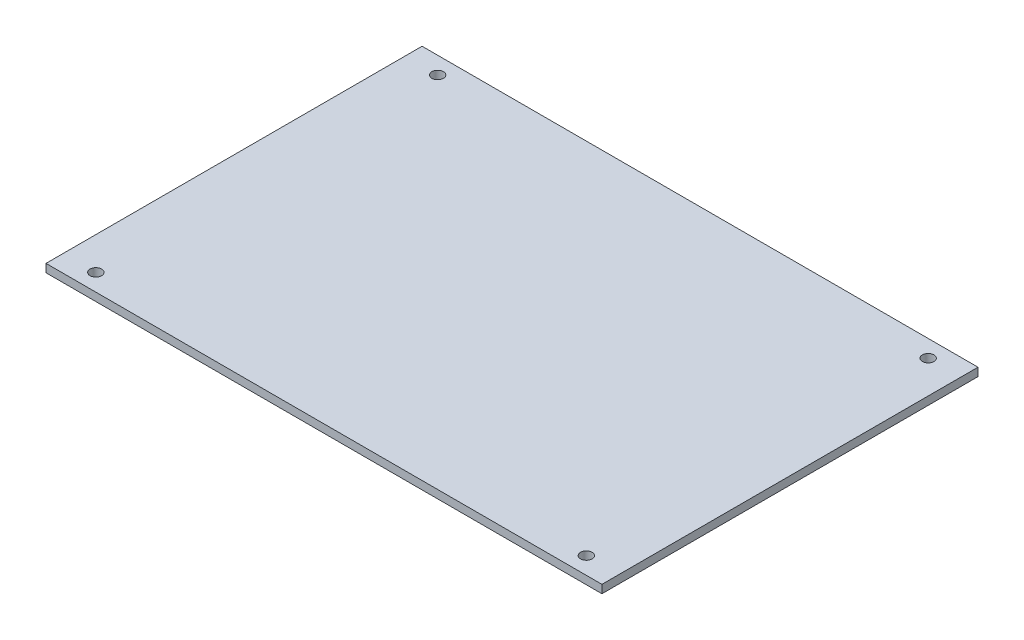
ISO-10303-21;
HEADER;
FILE_DESCRIPTION(('STEP AP214'),'2;1');
FILE_NAME('part.step','',(''),(''),'','','');
FILE_SCHEMA(('AUTOMOTIVE_DESIGN { 1 0 10303 214 1 1 1 1 }'));
ENDSEC;
DATA;
#1=APPLICATION_CONTEXT('core data for automotive mechanical design processes');
#2=APPLICATION_PROTOCOL_DEFINITION('international standard','automotive_design',2000,#1);
#3=PRODUCT_CONTEXT('',#1,'mechanical');
#4=PRODUCT('Part','Part','',(#3));
#5=PRODUCT_RELATED_PRODUCT_CATEGORY('part','',(#4));
#6=PRODUCT_DEFINITION_FORMATION('','',#4);
#7=PRODUCT_DEFINITION_CONTEXT('part definition',#1,'design');
#8=PRODUCT_DEFINITION('design','',#6,#7);
#9=PRODUCT_DEFINITION_SHAPE('','',#8);
#10=(LENGTH_UNIT() NAMED_UNIT(*) SI_UNIT(.MILLI.,.METRE.));
#11=(NAMED_UNIT(*) PLANE_ANGLE_UNIT() SI_UNIT($,.RADIAN.));
#12=(NAMED_UNIT(*) SI_UNIT($,.STERADIAN.) SOLID_ANGLE_UNIT());
#13=UNCERTAINTY_MEASURE_WITH_UNIT(LENGTH_MEASURE(1.E-05),#10,'distance_accuracy_value','');
#14=(GEOMETRIC_REPRESENTATION_CONTEXT(3) GLOBAL_UNCERTAINTY_ASSIGNED_CONTEXT((#13)) GLOBAL_UNIT_ASSIGNED_CONTEXT((#10,
#11,#12)) REPRESENTATION_CONTEXT('',''));
#15=CARTESIAN_POINT('',(0.,0.,0.));
#16=DIRECTION('',(0.,0.,1.));
#17=DIRECTION('',(1.,0.,0.));
#18=AXIS2_PLACEMENT_3D('',#15,#16,#17);
#19=CARTESIAN_POINT('',(107.95,3.17500000000001,73.0249999999997));
#20=DIRECTION('',(-1.,0.,0.));
#21=DIRECTION('',(0.,0.,1.));
#22=AXIS2_PLACEMENT_3D('',#19,#20,#21);
#23=PLANE('',#22);
#24=DIRECTION('',(0.,0.,-1.));
#25=VECTOR('',#24,1.);
#26=CARTESIAN_POINT('',(107.95,0.,73.0249999999997));
#27=LINE('',#26,#25);
#28=CARTESIAN_POINT('',(107.95,0.,73.0249999999997));
#29=VERTEX_POINT('',#28);
#30=CARTESIAN_POINT('',(107.95,0.,-73.025));
#31=VERTEX_POINT('',#30);
#32=EDGE_CURVE('E100',#29,#31,#27,.T.);
#33=ORIENTED_EDGE('',*,*,#32,.T.);
#34=DIRECTION('',(0.,-1.,0.));
#35=VECTOR('',#34,1.);
#36=CARTESIAN_POINT('',(107.95,3.17500000000001,-73.0250000000004));
#37=LINE('',#36,#35);
#38=CARTESIAN_POINT('',(107.95,3.17500000000001,-73.0250000000004));
#39=VERTEX_POINT('',#38);
#40=EDGE_CURVE('E11',#39,#31,#37,.T.);
#41=ORIENTED_EDGE('',*,*,#40,.F.);
#42=DIRECTION('',(0.,0.,-1.));
#43=VECTOR('',#42,1.);
#44=CARTESIAN_POINT('',(107.95,3.17500000000001,73.0249999999997));
#45=LINE('',#44,#43);
#46=CARTESIAN_POINT('',(107.95,3.17500000000001,73.0249999999997));
#47=VERTEX_POINT('',#46);
#48=EDGE_CURVE('E87',#47,#39,#45,.T.);
#49=ORIENTED_EDGE('',*,*,#48,.F.);
#50=DIRECTION('',(0.,-1.,0.));
#51=VECTOR('',#50,1.);
#52=CARTESIAN_POINT('',(107.95,3.17500000000001,73.0249999999997));
#53=LINE('',#52,#51);
#54=EDGE_CURVE('E96',#47,#29,#53,.T.);
#55=ORIENTED_EDGE('',*,*,#54,.T.);
#56=EDGE_LOOP('',(#33,#41,#49,#55));
#57=FACE_BOUND('',#56,.T.);
#58=ADVANCED_FACE('F34',(#57),#23,.F.);
#59=CARTESIAN_POINT('',(-107.95,3.17500000000001,-73.0250000000003));
#60=DIRECTION('',(0.,0.,1.));
#61=DIRECTION('',(1.,0.,0.));
#62=AXIS2_PLACEMENT_3D('',#59,#60,#61);
#63=PLANE('',#62);
#64=DIRECTION('',(-1.,0.,0.));
#65=VECTOR('',#64,1.);
#66=CARTESIAN_POINT('',(-107.95,0.,-73.0249999999999));
#67=LINE('',#66,#65);
#68=CARTESIAN_POINT('',(-107.95,0.,-73.0249999999999));
#69=VERTEX_POINT('',#68);
#70=EDGE_CURVE('E91',#31,#69,#67,.T.);
#71=ORIENTED_EDGE('',*,*,#70,.T.);
#72=DIRECTION('',(0.,-1.,0.));
#73=VECTOR('',#72,1.);
#74=CARTESIAN_POINT('',(-107.95,3.17500000000001,-73.0250000000003));
#75=LINE('',#74,#73);
#76=CARTESIAN_POINT('',(-107.95,3.17500000000001,-73.0250000000003));
#77=VERTEX_POINT('',#76);
#78=EDGE_CURVE('E43',#77,#69,#75,.T.);
#79=ORIENTED_EDGE('',*,*,#78,.F.);
#80=DIRECTION('',(-1.,0.,0.));
#81=VECTOR('',#80,1.);
#82=CARTESIAN_POINT('',(-107.95,3.17500000000001,-73.0250000000003));
#83=LINE('',#82,#81);
#84=EDGE_CURVE('E82',#39,#77,#83,.T.);
#85=ORIENTED_EDGE('',*,*,#84,.F.);
#86=ORIENTED_EDGE('',*,*,#40,.T.);
#87=EDGE_LOOP('',(#71,#79,#85,#86));
#88=FACE_BOUND('',#87,.T.);
#89=ADVANCED_FACE('F90',(#88),#63,.F.);
#90=CARTESIAN_POINT('',(-107.95,3.17500000000001,73.025));
#91=DIRECTION('',(1.,0.,0.));
#92=DIRECTION('',(0.,0.,-1.));
#93=AXIS2_PLACEMENT_3D('',#90,#91,#92);
#94=PLANE('',#93);
#95=DIRECTION('',(0.,0.,1.));
#96=VECTOR('',#95,1.);
#97=CARTESIAN_POINT('',(-107.95,0.,73.025));
#98=LINE('',#97,#96);
#99=CARTESIAN_POINT('',(-107.95,0.,73.025));
#100=VERTEX_POINT('',#99);
#101=EDGE_CURVE('E69',#69,#100,#98,.T.);
#102=ORIENTED_EDGE('',*,*,#101,.T.);
#103=DIRECTION('',(0.,-1.,0.));
#104=VECTOR('',#103,1.);
#105=CARTESIAN_POINT('',(-107.95,3.17500000000001,73.025));
#106=LINE('',#105,#104);
#107=CARTESIAN_POINT('',(-107.95,3.17500000000001,73.025));
#108=VERTEX_POINT('',#107);
#109=EDGE_CURVE('E92',#108,#100,#106,.T.);
#110=ORIENTED_EDGE('',*,*,#109,.F.);
#111=DIRECTION('',(0.,0.,1.));
#112=VECTOR('',#111,1.);
#113=CARTESIAN_POINT('',(-107.95,3.17500000000001,73.025));
#114=LINE('',#113,#112);
#115=EDGE_CURVE('E85',#77,#108,#114,.T.);
#116=ORIENTED_EDGE('',*,*,#115,.F.);
#117=ORIENTED_EDGE('',*,*,#78,.T.);
#118=EDGE_LOOP('',(#102,#110,#116,#117));
#119=FACE_BOUND('',#118,.T.);
#120=ADVANCED_FACE('F94',(#119),#94,.F.);
#121=CARTESIAN_POINT('',(-107.95,3.17500000000001,73.025));
#122=DIRECTION('',(0.,0.,-1.));
#123=DIRECTION('',(-1.,0.,0.));
#124=AXIS2_PLACEMENT_3D('',#121,#122,#123);
#125=PLANE('',#124);
#126=DIRECTION('',(1.,0.,0.));
#127=VECTOR('',#126,1.);
#128=CARTESIAN_POINT('',(-107.95,0.,73.025));
#129=LINE('',#128,#127);
#130=EDGE_CURVE('E75',#100,#29,#129,.T.);
#131=ORIENTED_EDGE('',*,*,#130,.T.);
#132=ORIENTED_EDGE('',*,*,#54,.F.);
#133=DIRECTION('',(1.,0.,0.));
#134=VECTOR('',#133,1.);
#135=CARTESIAN_POINT('',(-107.95,3.17500000000001,73.025));
#136=LINE('',#135,#134);
#137=EDGE_CURVE('E52',#108,#47,#136,.T.);
#138=ORIENTED_EDGE('',*,*,#137,.F.);
#139=ORIENTED_EDGE('',*,*,#109,.T.);
#140=EDGE_LOOP('',(#131,#132,#138,#139));
#141=FACE_BOUND('',#140,.T.);
#142=ADVANCED_FACE('F143',(#141),#125,.F.);
#143=CARTESIAN_POINT('',(0.,3.17500000000001,-3.88578058618805E-13));
#144=DIRECTION('',(0.,-1.,0.));
#145=DIRECTION('',(0.,0.,-1.));
#146=AXIS2_PLACEMENT_3D('',#143,#144,#145);
#147=PLANE('',#146);
#148=CARTESIAN_POINT('',(-95.2500000000001,3.17499999999998,-66.3812617000004));
#149=DIRECTION('',(0.,1.,0.));
#150=DIRECTION('',(0.,0.,1.));
#151=AXIS2_PLACEMENT_3D('',#148,#149,#150);
#152=CIRCLE('',#151,2.2479);
#153=CARTESIAN_POINT('',(-95.2500000000001,3.17499999999998,-64.1333617000004));
#154=VERTEX_POINT('',#153);
#155=EDGE_CURVE('E122',#154,#154,#152,.T.);
#156=ORIENTED_EDGE('',*,*,#155,.F.);
#157=EDGE_LOOP('',(#156));
#158=FACE_BOUND('',#157,.T.);
#159=CARTESIAN_POINT('',(95.2499999999999,3.17500000000018,-66.3812617000004));
#160=DIRECTION('',(0.,1.,0.));
#161=DIRECTION('',(0.,0.,1.));
#162=AXIS2_PLACEMENT_3D('',#159,#160,#161);
#163=CIRCLE('',#162,2.2479);
#164=CARTESIAN_POINT('',(95.2499999999999,3.17500000000018,-64.1333617000004));
#165=VERTEX_POINT('',#164);
#166=EDGE_CURVE('E111',#165,#165,#163,.T.);
#167=ORIENTED_EDGE('',*,*,#166,.F.);
#168=EDGE_LOOP('',(#167));
#169=FACE_BOUND('',#168,.T.);
#170=CARTESIAN_POINT('',(95.25,3.17500000000001,66.3812616999998));
#171=DIRECTION('',(0.,1.,0.));
#172=DIRECTION('',(0.,0.,1.));
#173=AXIS2_PLACEMENT_3D('',#170,#171,#172);
#174=CIRCLE('',#173,2.2479);
#175=CARTESIAN_POINT('',(95.25,3.17500000000001,68.6291616999998));
#176=VERTEX_POINT('',#175);
#177=EDGE_CURVE('E110',#176,#176,#174,.T.);
#178=ORIENTED_EDGE('',*,*,#177,.F.);
#179=EDGE_LOOP('',(#178));
#180=FACE_BOUND('',#179,.T.);
#181=CARTESIAN_POINT('',(-95.25,3.17500000000001,66.3812616999999));
#182=DIRECTION('',(0.,1.,0.));
#183=DIRECTION('',(0.,0.,1.));
#184=AXIS2_PLACEMENT_3D('',#181,#182,#183);
#185=CIRCLE('',#184,2.2479);
#186=CARTESIAN_POINT('',(-95.25,3.17500000000001,68.6291616999999));
#187=VERTEX_POINT('',#186);
#188=EDGE_CURVE('E127',#187,#187,#185,.T.);
#189=ORIENTED_EDGE('',*,*,#188,.F.);
#190=EDGE_LOOP('',(#189));
#191=FACE_BOUND('',#190,.T.);
#192=ORIENTED_EDGE('',*,*,#48,.T.);
#193=ORIENTED_EDGE('',*,*,#84,.T.);
#194=ORIENTED_EDGE('',*,*,#115,.T.);
#195=ORIENTED_EDGE('',*,*,#137,.T.);
#196=EDGE_LOOP('',(#192,#193,#194,#195));
#197=FACE_BOUND('',#196,.T.);
#198=ADVANCED_FACE('F83',(#158,#169,#180,#191,#197),#147,.F.);
#199=CARTESIAN_POINT('',(0.,0.,0.));
#200=DIRECTION('',(0.,-1.,0.));
#201=DIRECTION('',(0.,0.,-1.));
#202=AXIS2_PLACEMENT_3D('',#199,#200,#201);
#203=PLANE('',#202);
#204=CARTESIAN_POINT('',(-95.2500000000001,0.,-66.3812617));
#205=DIRECTION('',(0.,-1.,0.));
#206=DIRECTION('',(0.,0.,-1.));
#207=AXIS2_PLACEMENT_3D('',#204,#205,#206);
#208=CIRCLE('',#207,2.2479);
#209=CARTESIAN_POINT('',(-95.2500000000001,0.,-68.6291617));
#210=VERTEX_POINT('',#209);
#211=EDGE_CURVE('E37',#210,#210,#208,.T.);
#212=ORIENTED_EDGE('',*,*,#211,.F.);
#213=EDGE_LOOP('',(#212));
#214=FACE_BOUND('',#213,.T.);
#215=CARTESIAN_POINT('',(95.2499999999999,1.94289029309402E-13,-66.3812617));
#216=DIRECTION('',(0.,-1.,0.));
#217=DIRECTION('',(0.,0.,-1.));
#218=AXIS2_PLACEMENT_3D('',#215,#216,#217);
#219=CIRCLE('',#218,2.2479);
#220=CARTESIAN_POINT('',(95.2499999999999,1.94289029309402E-13,-68.6291617));
#221=VERTEX_POINT('',#220);
#222=EDGE_CURVE('E108',#221,#221,#219,.T.);
#223=ORIENTED_EDGE('',*,*,#222,.F.);
#224=EDGE_LOOP('',(#223));
#225=FACE_BOUND('',#224,.T.);
#226=CARTESIAN_POINT('',(95.25,0.,66.3812616999996));
#227=DIRECTION('',(0.,-1.,0.));
#228=DIRECTION('',(0.,0.,-1.));
#229=AXIS2_PLACEMENT_3D('',#226,#227,#228);
#230=CIRCLE('',#229,2.2479);
#231=CARTESIAN_POINT('',(95.25,0.,64.1333616999996));
#232=VERTEX_POINT('',#231);
#233=EDGE_CURVE('E115',#232,#232,#230,.T.);
#234=ORIENTED_EDGE('',*,*,#233,.F.);
#235=EDGE_LOOP('',(#234));
#236=FACE_BOUND('',#235,.T.);
#237=CARTESIAN_POINT('',(-95.25,0.,66.3812616999999));
#238=DIRECTION('',(0.,-1.,0.));
#239=DIRECTION('',(0.,0.,-1.));
#240=AXIS2_PLACEMENT_3D('',#237,#238,#239);
#241=CIRCLE('',#240,2.2479);
#242=CARTESIAN_POINT('',(-95.25,0.,64.1333617));
#243=VERTEX_POINT('',#242);
#244=EDGE_CURVE('E103',#243,#243,#241,.T.);
#245=ORIENTED_EDGE('',*,*,#244,.F.);
#246=EDGE_LOOP('',(#245));
#247=FACE_BOUND('',#246,.T.);
#248=ORIENTED_EDGE('',*,*,#32,.F.);
#249=ORIENTED_EDGE('',*,*,#130,.F.);
#250=ORIENTED_EDGE('',*,*,#101,.F.);
#251=ORIENTED_EDGE('',*,*,#70,.F.);
#252=EDGE_LOOP('',(#248,#249,#250,#251));
#253=FACE_BOUND('',#252,.T.);
#254=ADVANCED_FACE('F136',(#214,#225,#236,#247,#253),#203,.T.);
#255=CARTESIAN_POINT('',(-95.25,3.17500000000001,66.3812616999999));
#256=DIRECTION('',(0.,1.,0.));
#257=DIRECTION('',(0.,0.,1.));
#258=AXIS2_PLACEMENT_3D('',#255,#256,#257);
#259=CYLINDRICAL_SURFACE('',#258,2.2479);
#260=ORIENTED_EDGE('',*,*,#244,.T.);
#261=EDGE_LOOP('',(#260));
#262=FACE_BOUND('',#261,.T.);
#263=ORIENTED_EDGE('',*,*,#188,.T.);
#264=EDGE_LOOP('',(#263));
#265=FACE_BOUND('',#264,.T.);
#266=ADVANCED_FACE('F133',(#262,#265),#259,.F.);
#267=CARTESIAN_POINT('',(95.25,3.17500000000001,66.3812616999998));
#268=DIRECTION('',(0.,1.,0.));
#269=DIRECTION('',(0.,0.,1.));
#270=AXIS2_PLACEMENT_3D('',#267,#268,#269);
#271=CYLINDRICAL_SURFACE('',#270,2.2479);
#272=ORIENTED_EDGE('',*,*,#233,.T.);
#273=EDGE_LOOP('',(#272));
#274=FACE_BOUND('',#273,.T.);
#275=ORIENTED_EDGE('',*,*,#177,.T.);
#276=EDGE_LOOP('',(#275));
#277=FACE_BOUND('',#276,.T.);
#278=ADVANCED_FACE('F188',(#274,#277),#271,.F.);
#279=CARTESIAN_POINT('',(95.2499999999999,3.17500000000018,-66.3812617000004));
#280=DIRECTION('',(0.,1.,0.));
#281=DIRECTION('',(0.,0.,1.));
#282=AXIS2_PLACEMENT_3D('',#279,#280,#281);
#283=CYLINDRICAL_SURFACE('',#282,2.2479);
#284=ORIENTED_EDGE('',*,*,#222,.T.);
#285=EDGE_LOOP('',(#284));
#286=FACE_BOUND('',#285,.T.);
#287=ORIENTED_EDGE('',*,*,#166,.T.);
#288=EDGE_LOOP('',(#287));
#289=FACE_BOUND('',#288,.T.);
#290=ADVANCED_FACE('F197',(#286,#289),#283,.F.);
#291=CARTESIAN_POINT('',(-95.2500000000001,3.17499999999998,-66.3812617000004));
#292=DIRECTION('',(0.,1.,0.));
#293=DIRECTION('',(0.,0.,1.));
#294=AXIS2_PLACEMENT_3D('',#291,#292,#293);
#295=CYLINDRICAL_SURFACE('',#294,2.2479);
#296=ORIENTED_EDGE('',*,*,#211,.T.);
#297=EDGE_LOOP('',(#296));
#298=FACE_BOUND('',#297,.T.);
#299=ORIENTED_EDGE('',*,*,#155,.T.);
#300=EDGE_LOOP('',(#299));
#301=FACE_BOUND('',#300,.T.);
#302=ADVANCED_FACE('F207',(#298,#301),#295,.F.);
#303=CLOSED_SHELL('',(#58,#89,#120,#142,#198,#254,#266,#278,#290,#302));
#304=MANIFOLD_SOLID_BREP('B2',#303);
#305=ADVANCED_BREP_SHAPE_REPRESENTATION('',(#18,#304),#14);
#306=SHAPE_DEFINITION_REPRESENTATION(#9,#305);
ENDSEC;
END-ISO-10303-21;
